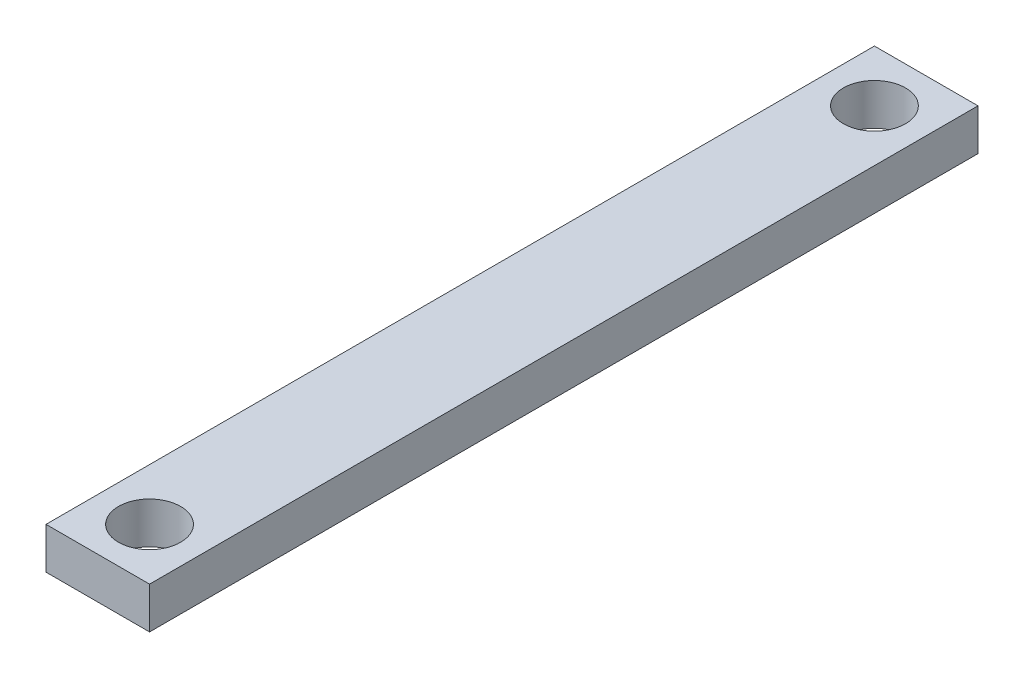
ISO-10303-21;
HEADER;
FILE_DESCRIPTION(('STEP AP214'),'2;1');
FILE_NAME('part.step','',(''),(''),'','','');
FILE_SCHEMA(('AUTOMOTIVE_DESIGN { 1 0 10303 214 1 1 1 1 }'));
ENDSEC;
DATA;
#1=APPLICATION_CONTEXT('core data for automotive mechanical design processes');
#2=APPLICATION_PROTOCOL_DEFINITION('international standard','automotive_design',2000,#1);
#3=PRODUCT_CONTEXT('',#1,'mechanical');
#4=PRODUCT('Part','Part','',(#3));
#5=PRODUCT_RELATED_PRODUCT_CATEGORY('part','',(#4));
#6=PRODUCT_DEFINITION_FORMATION('','',#4);
#7=PRODUCT_DEFINITION_CONTEXT('part definition',#1,'design');
#8=PRODUCT_DEFINITION('design','',#6,#7);
#9=PRODUCT_DEFINITION_SHAPE('','',#8);
#10=(LENGTH_UNIT() NAMED_UNIT(*) SI_UNIT(.MILLI.,.METRE.));
#11=(NAMED_UNIT(*) PLANE_ANGLE_UNIT() SI_UNIT($,.RADIAN.));
#12=(NAMED_UNIT(*) SI_UNIT($,.STERADIAN.) SOLID_ANGLE_UNIT());
#13=UNCERTAINTY_MEASURE_WITH_UNIT(LENGTH_MEASURE(1.E-05),#10,'distance_accuracy_value','');
#14=(GEOMETRIC_REPRESENTATION_CONTEXT(3) GLOBAL_UNCERTAINTY_ASSIGNED_CONTEXT((#13)) GLOBAL_UNIT_ASSIGNED_CONTEXT((#10,
#11,#12)) REPRESENTATION_CONTEXT('',''));
#15=CARTESIAN_POINT('',(0.,0.,0.));
#16=DIRECTION('',(0.,0.,1.));
#17=DIRECTION('',(1.,0.,0.));
#18=AXIS2_PLACEMENT_3D('',#15,#16,#17);
#19=CARTESIAN_POINT('',(0.,2.,0.));
#20=DIRECTION('',(0.,-1.,0.));
#21=DIRECTION('',(0.,0.,-1.));
#22=AXIS2_PLACEMENT_3D('',#19,#20,#21);
#23=PLANE('',#22);
#24=DIRECTION('',(1.,0.,0.));
#25=VECTOR('',#24,1.);
#26=CARTESIAN_POINT('',(0.,2.,0.));
#27=LINE('',#26,#25);
#28=CARTESIAN_POINT('',(0.,2.,0.));
#29=VERTEX_POINT('',#28);
#30=CARTESIAN_POINT('',(5.00000000000001,2.,0.));
#31=VERTEX_POINT('',#30);
#32=EDGE_CURVE('E126',#29,#31,#27,.T.);
#33=ORIENTED_EDGE('',*,*,#32,.F.);
#34=DIRECTION('',(0.,0.,1.));
#35=VECTOR('',#34,1.);
#36=CARTESIAN_POINT('',(0.,2.,0.));
#37=LINE('',#36,#35);
#38=CARTESIAN_POINT('',(0.,2.,40.));
#39=VERTEX_POINT('',#38);
#40=EDGE_CURVE('E116',#29,#39,#37,.T.);
#41=ORIENTED_EDGE('',*,*,#40,.T.);
#42=DIRECTION('',(1.,0.,0.));
#43=VECTOR('',#42,1.);
#44=CARTESIAN_POINT('',(0.,2.,40.));
#45=LINE('',#44,#43);
#46=CARTESIAN_POINT('',(5.00000000000001,2.,40.));
#47=VERTEX_POINT('',#46);
#48=EDGE_CURVE('E111',#39,#47,#45,.T.);
#49=ORIENTED_EDGE('',*,*,#48,.T.);
#50=DIRECTION('',(0.,0.,1.));
#51=VECTOR('',#50,1.);
#52=CARTESIAN_POINT('',(5.00000000000001,2.,0.));
#53=LINE('',#52,#51);
#54=EDGE_CURVE('E115',#31,#47,#53,.T.);
#55=ORIENTED_EDGE('',*,*,#54,.F.);
#56=EDGE_LOOP('',(#33,#41,#49,#55));
#57=FACE_BOUND('',#56,.T.);
#58=CARTESIAN_POINT('',(2.50000000000001,2.,37.5));
#59=DIRECTION('',(0.,1.,0.));
#60=DIRECTION('',(0.,0.,1.));
#61=AXIS2_PLACEMENT_3D('',#58,#59,#60);
#62=CIRCLE('',#61,1.5);
#63=CARTESIAN_POINT('',(2.50000000000001,2.,39.));
#64=VERTEX_POINT('',#63);
#65=EDGE_CURVE('E136',#64,#64,#62,.T.);
#66=ORIENTED_EDGE('',*,*,#65,.F.);
#67=EDGE_LOOP('',(#66));
#68=FACE_BOUND('',#67,.T.);
#69=CARTESIAN_POINT('',(2.50000000000001,2.,2.5));
#70=DIRECTION('',(0.,1.,0.));
#71=DIRECTION('',(0.,0.,1.));
#72=AXIS2_PLACEMENT_3D('',#69,#70,#71);
#73=CIRCLE('',#72,1.5);
#74=CARTESIAN_POINT('',(2.50000000000001,2.,4.));
#75=VERTEX_POINT('',#74);
#76=EDGE_CURVE('E177',#75,#75,#73,.T.);
#77=ORIENTED_EDGE('',*,*,#76,.F.);
#78=EDGE_LOOP('',(#77));
#79=FACE_BOUND('',#78,.T.);
#80=ADVANCED_FACE('F65',(#57,#68,#79),#23,.F.);
#81=CARTESIAN_POINT('',(0.,0.,0.));
#82=DIRECTION('',(0.,-1.,0.));
#83=DIRECTION('',(0.,0.,-1.));
#84=AXIS2_PLACEMENT_3D('',#81,#82,#83);
#85=PLANE('',#84);
#86=CARTESIAN_POINT('',(2.50000000000001,0.,37.5));
#87=DIRECTION('',(0.,1.,0.));
#88=DIRECTION('',(0.,0.,1.));
#89=AXIS2_PLACEMENT_3D('',#86,#87,#88);
#90=CIRCLE('',#89,1.5);
#91=CARTESIAN_POINT('',(2.50000000000001,0.,39.));
#92=VERTEX_POINT('',#91);
#93=EDGE_CURVE('E176',#92,#92,#90,.T.);
#94=ORIENTED_EDGE('',*,*,#93,.T.);
#95=EDGE_LOOP('',(#94));
#96=FACE_BOUND('',#95,.T.);
#97=DIRECTION('',(1.,0.,0.));
#98=VECTOR('',#97,1.);
#99=CARTESIAN_POINT('',(0.,0.,0.));
#100=LINE('',#99,#98);
#101=CARTESIAN_POINT('',(0.,0.,0.));
#102=VERTEX_POINT('',#101);
#103=CARTESIAN_POINT('',(5.00000000000001,0.,0.));
#104=VERTEX_POINT('',#103);
#105=EDGE_CURVE('E132',#102,#104,#100,.T.);
#106=ORIENTED_EDGE('',*,*,#105,.T.);
#107=DIRECTION('',(0.,0.,1.));
#108=VECTOR('',#107,1.);
#109=CARTESIAN_POINT('',(5.00000000000001,0.,0.));
#110=LINE('',#109,#108);
#111=CARTESIAN_POINT('',(5.00000000000001,0.,40.));
#112=VERTEX_POINT('',#111);
#113=EDGE_CURVE('E135',#104,#112,#110,.T.);
#114=ORIENTED_EDGE('',*,*,#113,.T.);
#115=DIRECTION('',(1.,0.,0.));
#116=VECTOR('',#115,1.);
#117=CARTESIAN_POINT('',(0.,0.,40.));
#118=LINE('',#117,#116);
#119=CARTESIAN_POINT('',(0.,0.,40.));
#120=VERTEX_POINT('',#119);
#121=EDGE_CURVE('E123',#120,#112,#118,.T.);
#122=ORIENTED_EDGE('',*,*,#121,.F.);
#123=DIRECTION('',(0.,0.,1.));
#124=VECTOR('',#123,1.);
#125=CARTESIAN_POINT('',(0.,0.,0.));
#126=LINE('',#125,#124);
#127=EDGE_CURVE('E99',#102,#120,#126,.T.);
#128=ORIENTED_EDGE('',*,*,#127,.F.);
#129=EDGE_LOOP('',(#106,#114,#122,#128));
#130=FACE_BOUND('',#129,.T.);
#131=CARTESIAN_POINT('',(2.50000000000001,0.,2.5));
#132=DIRECTION('',(0.,1.,0.));
#133=DIRECTION('',(0.,0.,1.));
#134=AXIS2_PLACEMENT_3D('',#131,#132,#133);
#135=CIRCLE('',#134,1.5);
#136=CARTESIAN_POINT('',(2.50000000000001,0.,4.));
#137=VERTEX_POINT('',#136);
#138=EDGE_CURVE('E180',#137,#137,#135,.T.);
#139=ORIENTED_EDGE('',*,*,#138,.T.);
#140=EDGE_LOOP('',(#139));
#141=FACE_BOUND('',#140,.T.);
#142=ADVANCED_FACE('F141',(#96,#130,#141),#85,.T.);
#143=CARTESIAN_POINT('',(0.,2.,0.));
#144=DIRECTION('',(0.,0.,-1.));
#145=DIRECTION('',(-1.,0.,0.));
#146=AXIS2_PLACEMENT_3D('',#143,#144,#145);
#147=PLANE('',#146);
#148=ORIENTED_EDGE('',*,*,#105,.F.);
#149=DIRECTION('',(0.,-1.,0.));
#150=VECTOR('',#149,1.);
#151=CARTESIAN_POINT('',(0.,2.,0.));
#152=LINE('',#151,#150);
#153=EDGE_CURVE('E12',#29,#102,#152,.T.);
#154=ORIENTED_EDGE('',*,*,#153,.F.);
#155=ORIENTED_EDGE('',*,*,#32,.T.);
#156=DIRECTION('',(0.,-1.,0.));
#157=VECTOR('',#156,1.);
#158=CARTESIAN_POINT('',(5.00000000000001,2.,0.));
#159=LINE('',#158,#157);
#160=EDGE_CURVE('E69',#31,#104,#159,.T.);
#161=ORIENTED_EDGE('',*,*,#160,.T.);
#162=EDGE_LOOP('',(#148,#154,#155,#161));
#163=FACE_BOUND('',#162,.T.);
#164=ADVANCED_FACE('F67',(#163),#147,.T.);
#165=CARTESIAN_POINT('',(0.,2.,0.));
#166=DIRECTION('',(1.,0.,0.));
#167=DIRECTION('',(0.,0.,-1.));
#168=AXIS2_PLACEMENT_3D('',#165,#166,#167);
#169=PLANE('',#168);
#170=ORIENTED_EDGE('',*,*,#127,.T.);
#171=DIRECTION('',(0.,-1.,0.));
#172=VECTOR('',#171,1.);
#173=CARTESIAN_POINT('',(0.,2.,40.));
#174=LINE('',#173,#172);
#175=EDGE_CURVE('E75',#39,#120,#174,.T.);
#176=ORIENTED_EDGE('',*,*,#175,.F.);
#177=ORIENTED_EDGE('',*,*,#40,.F.);
#178=ORIENTED_EDGE('',*,*,#153,.T.);
#179=EDGE_LOOP('',(#170,#176,#177,#178));
#180=FACE_BOUND('',#179,.T.);
#181=ADVANCED_FACE('F144',(#180),#169,.F.);
#182=CARTESIAN_POINT('',(0.,2.,40.));
#183=DIRECTION('',(0.,0.,-1.));
#184=DIRECTION('',(-1.,0.,0.));
#185=AXIS2_PLACEMENT_3D('',#182,#183,#184);
#186=PLANE('',#185);
#187=ORIENTED_EDGE('',*,*,#121,.T.);
#188=DIRECTION('',(0.,-1.,0.));
#189=VECTOR('',#188,1.);
#190=CARTESIAN_POINT('',(5.00000000000001,2.,40.));
#191=LINE('',#190,#189);
#192=EDGE_CURVE('E120',#47,#112,#191,.T.);
#193=ORIENTED_EDGE('',*,*,#192,.F.);
#194=ORIENTED_EDGE('',*,*,#48,.F.);
#195=ORIENTED_EDGE('',*,*,#175,.T.);
#196=EDGE_LOOP('',(#187,#193,#194,#195));
#197=FACE_BOUND('',#196,.T.);
#198=ADVANCED_FACE('F121',(#197),#186,.F.);
#199=CARTESIAN_POINT('',(5.00000000000001,2.,0.));
#200=DIRECTION('',(1.,0.,0.));
#201=DIRECTION('',(0.,0.,-1.));
#202=AXIS2_PLACEMENT_3D('',#199,#200,#201);
#203=PLANE('',#202);
#204=ORIENTED_EDGE('',*,*,#113,.F.);
#205=ORIENTED_EDGE('',*,*,#160,.F.);
#206=ORIENTED_EDGE('',*,*,#54,.T.);
#207=ORIENTED_EDGE('',*,*,#192,.T.);
#208=EDGE_LOOP('',(#204,#205,#206,#207));
#209=FACE_BOUND('',#208,.T.);
#210=ADVANCED_FACE('F125',(#209),#203,.T.);
#211=CARTESIAN_POINT('',(2.50000000000001,2.,37.5));
#212=DIRECTION('',(0.,-1.,0.));
#213=DIRECTION('',(0.,0.,-1.));
#214=AXIS2_PLACEMENT_3D('',#211,#212,#213);
#215=CYLINDRICAL_SURFACE('',#214,1.5);
#216=ORIENTED_EDGE('',*,*,#65,.T.);
#217=EDGE_LOOP('',(#216));
#218=FACE_BOUND('',#217,.T.);
#219=ORIENTED_EDGE('',*,*,#93,.F.);
#220=EDGE_LOOP('',(#219));
#221=FACE_BOUND('',#220,.T.);
#222=ADVANCED_FACE('F157',(#218,#221),#215,.F.);
#223=CARTESIAN_POINT('',(2.50000000000001,2.,2.5));
#224=DIRECTION('',(0.,-1.,0.));
#225=DIRECTION('',(0.,0.,-1.));
#226=AXIS2_PLACEMENT_3D('',#223,#224,#225);
#227=CYLINDRICAL_SURFACE('',#226,1.5);
#228=ORIENTED_EDGE('',*,*,#76,.T.);
#229=EDGE_LOOP('',(#228));
#230=FACE_BOUND('',#229,.T.);
#231=ORIENTED_EDGE('',*,*,#138,.F.);
#232=EDGE_LOOP('',(#231));
#233=FACE_BOUND('',#232,.T.);
#234=ADVANCED_FACE('F165',(#230,#233),#227,.F.);
#235=CLOSED_SHELL('',(#80,#142,#164,#181,#198,#210,#222,#234));
#236=MANIFOLD_SOLID_BREP('B2',#235);
#237=ADVANCED_BREP_SHAPE_REPRESENTATION('',(#18,#236),#14);
#238=SHAPE_DEFINITION_REPRESENTATION(#9,#237);
ENDSEC;
END-ISO-10303-21;
